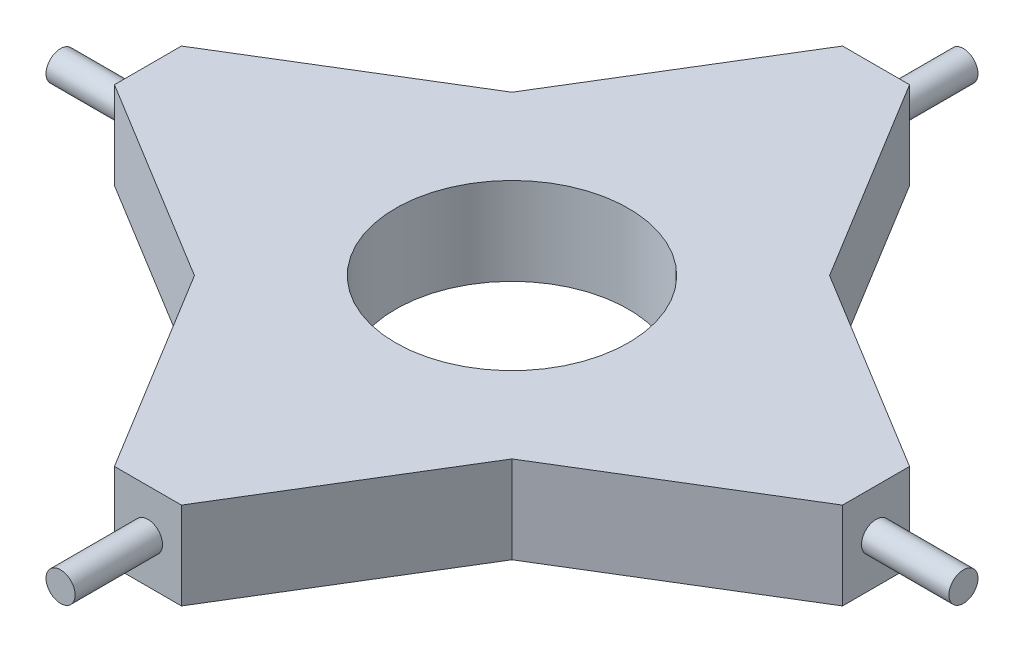
ISO-10303-21;
HEADER;
FILE_DESCRIPTION(('STEP AP214'),'2;1');
FILE_NAME('part.step','',(''),(''),'','','');
FILE_SCHEMA(('AUTOMOTIVE_DESIGN { 1 0 10303 214 1 1 1 1 }'));
ENDSEC;
DATA;
#1=APPLICATION_CONTEXT('core data for automotive mechanical design processes');
#2=APPLICATION_PROTOCOL_DEFINITION('international standard','automotive_design',2000,#1);
#3=PRODUCT_CONTEXT('',#1,'mechanical');
#4=PRODUCT('Part','Part','',(#3));
#5=PRODUCT_RELATED_PRODUCT_CATEGORY('part','',(#4));
#6=PRODUCT_DEFINITION_FORMATION('','',#4);
#7=PRODUCT_DEFINITION_CONTEXT('part definition',#1,'design');
#8=PRODUCT_DEFINITION('design','',#6,#7);
#9=PRODUCT_DEFINITION_SHAPE('','',#8);
#10=(LENGTH_UNIT() NAMED_UNIT(*) SI_UNIT(.MILLI.,.METRE.));
#11=(NAMED_UNIT(*) PLANE_ANGLE_UNIT() SI_UNIT($,.RADIAN.));
#12=(NAMED_UNIT(*) SI_UNIT($,.STERADIAN.) SOLID_ANGLE_UNIT());
#13=UNCERTAINTY_MEASURE_WITH_UNIT(LENGTH_MEASURE(1.E-05),#10,'distance_accuracy_value','');
#14=(GEOMETRIC_REPRESENTATION_CONTEXT(3) GLOBAL_UNCERTAINTY_ASSIGNED_CONTEXT((#13)) GLOBAL_UNIT_ASSIGNED_CONTEXT((#10,
#11,#12)) REPRESENTATION_CONTEXT('',''));
#15=CARTESIAN_POINT('',(0.,0.,0.));
#16=DIRECTION('',(0.,0.,1.));
#17=DIRECTION('',(1.,0.,0.));
#18=AXIS2_PLACEMENT_3D('',#15,#16,#17);
#19=CARTESIAN_POINT('',(0.,30.,0.));
#20=DIRECTION('',(0.,1.,0.));
#21=DIRECTION('',(0.,0.,1.));
#22=AXIS2_PLACEMENT_3D('',#19,#20,#21);
#23=PLANE('',#22);
#24=DIRECTION('',(0.85357003057373,0.,0.520978121331752));
#25=VECTOR('',#24,1.);
#26=CARTESIAN_POINT('',(-125.000000000001,30.,11.5000000000001));
#27=LINE('',#26,#25);
#28=CARTESIAN_POINT('',(-125.000000000001,30.,11.5000000000001));
#29=VERTEX_POINT('',#28);
#30=CARTESIAN_POINT('',(-54.5185124392927,30.,54.5185124392946));
#31=VERTEX_POINT('',#30);
#32=EDGE_CURVE('E185',#29,#31,#27,.T.);
#33=ORIENTED_EDGE('',*,*,#32,.T.);
#34=DIRECTION('',(0.520978121331738,0.,0.853570030573739));
#35=VECTOR('',#34,1.);
#36=CARTESIAN_POINT('',(-11.5000000000009,30.,125.000000000001));
#37=LINE('',#36,#35);
#38=CARTESIAN_POINT('',(-11.5000000000009,30.,125.000000000001));
#39=VERTEX_POINT('',#38);
#40=EDGE_CURVE('E113',#31,#39,#37,.T.);
#41=ORIENTED_EDGE('',*,*,#40,.T.);
#42=DIRECTION('',(1.,0.,0.));
#43=VECTOR('',#42,1.);
#44=CARTESIAN_POINT('',(-11.5000000000009,30.,125.000000000001));
#45=LINE('',#44,#43);
#46=CARTESIAN_POINT('',(11.4999999999991,30.,125.000000000001));
#47=VERTEX_POINT('',#46);
#48=EDGE_CURVE('E230',#39,#47,#45,.T.);
#49=ORIENTED_EDGE('',*,*,#48,.T.);
#50=DIRECTION('',(0.520978121331749,0.,-0.853570030573732));
#51=VECTOR('',#50,1.);
#52=CARTESIAN_POINT('',(11.4999999999991,30.,125.000000000001));
#53=LINE('',#52,#51);
#54=CARTESIAN_POINT('',(54.5185124392932,30.,54.5185124392928));
#55=VERTEX_POINT('',#54);
#56=EDGE_CURVE('E232',#47,#55,#53,.T.);
#57=ORIENTED_EDGE('',*,*,#56,.T.);
#58=DIRECTION('',(0.85357003057374,0.,-0.520978121331736));
#59=VECTOR('',#58,1.);
#60=CARTESIAN_POINT('',(125.,30.,11.500000000001));
#61=LINE('',#60,#59);
#62=CARTESIAN_POINT('',(125.,30.,11.500000000001));
#63=VERTEX_POINT('',#62);
#64=EDGE_CURVE('E234',#55,#63,#61,.T.);
#65=ORIENTED_EDGE('',*,*,#64,.T.);
#66=DIRECTION('',(0.,0.,-1.));
#67=VECTOR('',#66,1.);
#68=CARTESIAN_POINT('',(125.,30.,11.500000000001));
#69=LINE('',#68,#67);
#70=CARTESIAN_POINT('',(125.,30.,-11.499999999999));
#71=VERTEX_POINT('',#70);
#72=EDGE_CURVE('E236',#63,#71,#69,.T.);
#73=ORIENTED_EDGE('',*,*,#72,.T.);
#74=DIRECTION('',(-0.85357003057373,0.,-0.520978121331753));
#75=VECTOR('',#74,1.);
#76=CARTESIAN_POINT('',(125.,30.,-11.499999999999));
#77=LINE('',#76,#75);
#78=CARTESIAN_POINT('',(54.5185124392918,30.,-54.5185124392937));
#79=VERTEX_POINT('',#78);
#80=EDGE_CURVE('E238',#71,#79,#77,.T.);
#81=ORIENTED_EDGE('',*,*,#80,.T.);
#82=DIRECTION('',(-0.520978121331738,0.,-0.853570030573739));
#83=VECTOR('',#82,1.);
#84=CARTESIAN_POINT('',(11.5,30.,-125.));
#85=LINE('',#84,#83);
#86=CARTESIAN_POINT('',(11.5,30.,-125.));
#87=VERTEX_POINT('',#86);
#88=EDGE_CURVE('E240',#79,#87,#85,.T.);
#89=ORIENTED_EDGE('',*,*,#88,.T.);
#90=DIRECTION('',(-1.,0.,0.));
#91=VECTOR('',#90,1.);
#92=CARTESIAN_POINT('',(11.5,30.,-125.));
#93=LINE('',#92,#91);
#94=CARTESIAN_POINT('',(-11.5,30.,-125.));
#95=VERTEX_POINT('',#94);
#96=EDGE_CURVE('E144',#87,#95,#93,.T.);
#97=ORIENTED_EDGE('',*,*,#96,.T.);
#98=DIRECTION('',(-0.520978121331752,0.,0.85357003057373));
#99=VECTOR('',#98,1.);
#100=CARTESIAN_POINT('',(-11.5,30.,-125.));
#101=LINE('',#100,#99);
#102=CARTESIAN_POINT('',(-54.5185124392946,30.,-54.5185124392918));
#103=VERTEX_POINT('',#102);
#104=EDGE_CURVE('E138',#95,#103,#101,.T.);
#105=ORIENTED_EDGE('',*,*,#104,.T.);
#106=DIRECTION('',(-0.853570030573738,0.,0.520978121331738));
#107=VECTOR('',#106,1.);
#108=CARTESIAN_POINT('',(-125.000000000001,30.,-11.4999999999999));
#109=LINE('',#108,#107);
#110=CARTESIAN_POINT('',(-125.000000000001,30.,-11.4999999999999));
#111=VERTEX_POINT('',#110);
#112=EDGE_CURVE('E142',#103,#111,#109,.T.);
#113=ORIENTED_EDGE('',*,*,#112,.T.);
#114=DIRECTION('',(0.,0.,1.));
#115=VECTOR('',#114,1.);
#116=CARTESIAN_POINT('',(-125.000000000001,30.,-11.4999999999999));
#117=LINE('',#116,#115);
#118=EDGE_CURVE('E57',#111,#29,#117,.T.);
#119=ORIENTED_EDGE('',*,*,#118,.T.);
#120=EDGE_LOOP('',(#33,#41,#49,#57,#65,#73,#81,#89,#97,#105,#113,#119));
#121=FACE_BOUND('',#120,.T.);
#122=CARTESIAN_POINT('',(0.,30.,0.));
#123=DIRECTION('',(0.,1.,0.));
#124=DIRECTION('',(0.,0.,1.));
#125=AXIS2_PLACEMENT_3D('',#122,#123,#124);
#126=CIRCLE('',#125,40.);
#127=CARTESIAN_POINT('',(0.,30.,40.));
#128=VERTEX_POINT('',#127);
#129=EDGE_CURVE('E166',#128,#128,#126,.T.);
#130=ORIENTED_EDGE('',*,*,#129,.F.);
#131=EDGE_LOOP('',(#130));
#132=FACE_BOUND('',#131,.T.);
#133=ADVANCED_FACE('F38',(#121,#132),#23,.T.);
#134=CARTESIAN_POINT('',(0.,0.,0.));
#135=DIRECTION('',(0.,1.,0.));
#136=DIRECTION('',(0.,0.,1.));
#137=AXIS2_PLACEMENT_3D('',#134,#135,#136);
#138=PLANE('',#137);
#139=DIRECTION('',(0.85357003057373,0.,0.520978121331752));
#140=VECTOR('',#139,1.);
#141=CARTESIAN_POINT('',(-125.000000000001,0.,11.5000000000001));
#142=LINE('',#141,#140);
#143=CARTESIAN_POINT('',(-125.000000000001,0.,11.5000000000001));
#144=VERTEX_POINT('',#143);
#145=CARTESIAN_POINT('',(-54.5185124392927,0.,54.5185124392946));
#146=VERTEX_POINT('',#145);
#147=EDGE_CURVE('E162',#144,#146,#142,.T.);
#148=ORIENTED_EDGE('',*,*,#147,.F.);
#149=DIRECTION('',(0.,0.,1.));
#150=VECTOR('',#149,1.);
#151=CARTESIAN_POINT('',(-125.000000000001,0.,-11.4999999999999));
#152=LINE('',#151,#150);
#153=CARTESIAN_POINT('',(-125.000000000001,0.,-11.4999999999999));
#154=VERTEX_POINT('',#153);
#155=EDGE_CURVE('E104',#154,#144,#152,.T.);
#156=ORIENTED_EDGE('',*,*,#155,.F.);
#157=DIRECTION('',(-0.853570030573738,0.,0.520978121331738));
#158=VECTOR('',#157,1.);
#159=CARTESIAN_POINT('',(-125.000000000001,0.,-11.4999999999999));
#160=LINE('',#159,#158);
#161=CARTESIAN_POINT('',(-54.5185124392946,0.,-54.5185124392918));
#162=VERTEX_POINT('',#161);
#163=EDGE_CURVE('E98',#162,#154,#160,.T.);
#164=ORIENTED_EDGE('',*,*,#163,.F.);
#165=DIRECTION('',(-0.520978121331752,0.,0.85357003057373));
#166=VECTOR('',#165,1.);
#167=CARTESIAN_POINT('',(-11.5,0.,-125.));
#168=LINE('',#167,#166);
#169=CARTESIAN_POINT('',(-11.5,0.,-125.));
#170=VERTEX_POINT('',#169);
#171=EDGE_CURVE('E152',#170,#162,#168,.T.);
#172=ORIENTED_EDGE('',*,*,#171,.F.);
#173=DIRECTION('',(-1.,0.,0.));
#174=VECTOR('',#173,1.);
#175=CARTESIAN_POINT('',(11.5,0.,-125.));
#176=LINE('',#175,#174);
#177=CARTESIAN_POINT('',(11.5,0.,-125.));
#178=VERTEX_POINT('',#177);
#179=EDGE_CURVE('E180',#178,#170,#176,.T.);
#180=ORIENTED_EDGE('',*,*,#179,.F.);
#181=DIRECTION('',(-0.520978121331738,0.,-0.853570030573739));
#182=VECTOR('',#181,1.);
#183=CARTESIAN_POINT('',(11.5,0.,-125.));
#184=LINE('',#183,#182);
#185=CARTESIAN_POINT('',(54.5185124392918,0.,-54.5185124392937));
#186=VERTEX_POINT('',#185);
#187=EDGE_CURVE('E178',#186,#178,#184,.T.);
#188=ORIENTED_EDGE('',*,*,#187,.F.);
#189=DIRECTION('',(-0.85357003057373,0.,-0.520978121331753));
#190=VECTOR('',#189,1.);
#191=CARTESIAN_POINT('',(125.,0.,-11.499999999999));
#192=LINE('',#191,#190);
#193=CARTESIAN_POINT('',(125.,0.,-11.499999999999));
#194=VERTEX_POINT('',#193);
#195=EDGE_CURVE('E176',#194,#186,#192,.T.);
#196=ORIENTED_EDGE('',*,*,#195,.F.);
#197=DIRECTION('',(0.,0.,-1.));
#198=VECTOR('',#197,1.);
#199=CARTESIAN_POINT('',(125.,0.,11.500000000001));
#200=LINE('',#199,#198);
#201=CARTESIAN_POINT('',(125.,0.,11.500000000001));
#202=VERTEX_POINT('',#201);
#203=EDGE_CURVE('E174',#202,#194,#200,.T.);
#204=ORIENTED_EDGE('',*,*,#203,.F.);
#205=DIRECTION('',(0.85357003057374,0.,-0.520978121331736));
#206=VECTOR('',#205,1.);
#207=CARTESIAN_POINT('',(125.,0.,11.500000000001));
#208=LINE('',#207,#206);
#209=CARTESIAN_POINT('',(54.5185124392932,0.,54.5185124392928));
#210=VERTEX_POINT('',#209);
#211=EDGE_CURVE('E172',#210,#202,#208,.T.);
#212=ORIENTED_EDGE('',*,*,#211,.F.);
#213=DIRECTION('',(0.520978121331749,0.,-0.853570030573732));
#214=VECTOR('',#213,1.);
#215=CARTESIAN_POINT('',(11.4999999999991,0.,125.000000000001));
#216=LINE('',#215,#214);
#217=CARTESIAN_POINT('',(11.4999999999991,0.,125.000000000001));
#218=VERTEX_POINT('',#217);
#219=EDGE_CURVE('E170',#218,#210,#216,.T.);
#220=ORIENTED_EDGE('',*,*,#219,.F.);
#221=DIRECTION('',(1.,0.,0.));
#222=VECTOR('',#221,1.);
#223=CARTESIAN_POINT('',(-11.5000000000009,0.,125.000000000001));
#224=LINE('',#223,#222);
#225=CARTESIAN_POINT('',(-11.5000000000009,0.,125.000000000001));
#226=VERTEX_POINT('',#225);
#227=EDGE_CURVE('E168',#226,#218,#224,.T.);
#228=ORIENTED_EDGE('',*,*,#227,.F.);
#229=DIRECTION('',(0.520978121331738,0.,0.853570030573739));
#230=VECTOR('',#229,1.);
#231=CARTESIAN_POINT('',(-11.5000000000009,0.,125.000000000001));
#232=LINE('',#231,#230);
#233=EDGE_CURVE('E165',#146,#226,#232,.T.);
#234=ORIENTED_EDGE('',*,*,#233,.F.);
#235=EDGE_LOOP('',(#148,#156,#164,#172,#180,#188,#196,#204,#212,#220,#228,#234));
#236=FACE_BOUND('',#235,.T.);
#237=CARTESIAN_POINT('',(0.,0.,0.));
#238=DIRECTION('',(0.,1.,0.));
#239=DIRECTION('',(0.,0.,1.));
#240=AXIS2_PLACEMENT_3D('',#237,#238,#239);
#241=CIRCLE('',#240,40.);
#242=CARTESIAN_POINT('',(0.,0.,40.));
#243=VERTEX_POINT('',#242);
#244=EDGE_CURVE('E225',#243,#243,#241,.T.);
#245=ORIENTED_EDGE('',*,*,#244,.T.);
#246=EDGE_LOOP('',(#245));
#247=FACE_BOUND('',#246,.T.);
#248=ADVANCED_FACE('F253',(#236,#247),#138,.F.);
#249=CARTESIAN_POINT('',(-125.000000000001,30.,11.5000000000001));
#250=DIRECTION('',(0.520978121331752,0.,-0.85357003057373));
#251=DIRECTION('',(-0.85357003057373,0.,-0.520978121331752));
#252=AXIS2_PLACEMENT_3D('',#249,#250,#251);
#253=PLANE('',#252);
#254=ORIENTED_EDGE('',*,*,#147,.T.);
#255=DIRECTION('',(0.,-1.,0.));
#256=VECTOR('',#255,1.);
#257=CARTESIAN_POINT('',(-54.5185124392927,30.,54.5185124392946));
#258=LINE('',#257,#256);
#259=EDGE_CURVE('E42',#31,#146,#258,.T.);
#260=ORIENTED_EDGE('',*,*,#259,.F.);
#261=ORIENTED_EDGE('',*,*,#32,.F.);
#262=DIRECTION('',(0.,-1.,0.));
#263=VECTOR('',#262,1.);
#264=CARTESIAN_POINT('',(-125.000000000001,30.,11.5000000000001));
#265=LINE('',#264,#263);
#266=EDGE_CURVE('E158',#29,#144,#265,.T.);
#267=ORIENTED_EDGE('',*,*,#266,.T.);
#268=EDGE_LOOP('',(#254,#260,#261,#267));
#269=FACE_BOUND('',#268,.T.);
#270=ADVANCED_FACE('F40',(#269),#253,.F.);
#271=CARTESIAN_POINT('',(-11.5000000000009,30.,125.000000000001));
#272=DIRECTION('',(0.853570030573738,0.,-0.520978121331738));
#273=DIRECTION('',(-0.520978121331738,0.,-0.853570030573739));
#274=AXIS2_PLACEMENT_3D('',#271,#272,#273);
#275=PLANE('',#274);
#276=ORIENTED_EDGE('',*,*,#233,.T.);
#277=DIRECTION('',(0.,-1.,0.));
#278=VECTOR('',#277,1.);
#279=CARTESIAN_POINT('',(-11.5000000000009,30.,125.000000000001));
#280=LINE('',#279,#278);
#281=EDGE_CURVE('E206',#39,#226,#280,.T.);
#282=ORIENTED_EDGE('',*,*,#281,.F.);
#283=ORIENTED_EDGE('',*,*,#40,.F.);
#284=ORIENTED_EDGE('',*,*,#259,.T.);
#285=EDGE_LOOP('',(#276,#282,#283,#284));
#286=FACE_BOUND('',#285,.T.);
#287=ADVANCED_FACE('F358',(#286),#275,.F.);
#288=CARTESIAN_POINT('',(-11.5000000000009,30.,125.000000000001));
#289=DIRECTION('',(0.,0.,-1.));
#290=DIRECTION('',(-1.,0.,0.));
#291=AXIS2_PLACEMENT_3D('',#288,#289,#290);
#292=PLANE('',#291);
#293=CARTESIAN_POINT('',(0.,15.,125.000000000001));
#294=DIRECTION('',(0.,0.,1.));
#295=DIRECTION('',(1.,0.,0.));
#296=AXIS2_PLACEMENT_3D('',#293,#294,#295);
#297=CIRCLE('',#296,5.);
#298=CARTESIAN_POINT('',(5.,15.,125.000000000001));
#299=VERTEX_POINT('',#298);
#300=EDGE_CURVE('E211',#299,#299,#297,.T.);
#301=ORIENTED_EDGE('',*,*,#300,.F.);
#302=EDGE_LOOP('',(#301));
#303=FACE_BOUND('',#302,.T.);
#304=ORIENTED_EDGE('',*,*,#227,.T.);
#305=DIRECTION('',(0.,-1.,0.));
#306=VECTOR('',#305,1.);
#307=CARTESIAN_POINT('',(11.4999999999991,30.,125.000000000001));
#308=LINE('',#307,#306);
#309=EDGE_CURVE('E204',#47,#218,#308,.T.);
#310=ORIENTED_EDGE('',*,*,#309,.F.);
#311=ORIENTED_EDGE('',*,*,#48,.F.);
#312=ORIENTED_EDGE('',*,*,#281,.T.);
#313=EDGE_LOOP('',(#304,#310,#311,#312));
#314=FACE_BOUND('',#313,.T.);
#315=ADVANCED_FACE('F355',(#303,#314),#292,.F.);
#316=CARTESIAN_POINT('',(11.4999999999991,30.,125.000000000001));
#317=DIRECTION('',(-0.853570030573732,0.,-0.520978121331748));
#318=DIRECTION('',(-0.520978121331748,0.,0.853570030573732));
#319=AXIS2_PLACEMENT_3D('',#316,#317,#318);
#320=PLANE('',#319);
#321=ORIENTED_EDGE('',*,*,#219,.T.);
#322=DIRECTION('',(0.,-1.,0.));
#323=VECTOR('',#322,1.);
#324=CARTESIAN_POINT('',(54.5185124392932,30.,54.5185124392928));
#325=LINE('',#324,#323);
#326=EDGE_CURVE('E201',#55,#210,#325,.T.);
#327=ORIENTED_EDGE('',*,*,#326,.F.);
#328=ORIENTED_EDGE('',*,*,#56,.F.);
#329=ORIENTED_EDGE('',*,*,#309,.T.);
#330=EDGE_LOOP('',(#321,#327,#328,#329));
#331=FACE_BOUND('',#330,.T.);
#332=ADVANCED_FACE('F351',(#331),#320,.F.);
#333=CARTESIAN_POINT('',(125.,30.,11.500000000001));
#334=DIRECTION('',(-0.520978121331736,0.,-0.85357003057374));
#335=DIRECTION('',(-0.85357003057374,0.,0.520978121331736));
#336=AXIS2_PLACEMENT_3D('',#333,#334,#335);
#337=PLANE('',#336);
#338=ORIENTED_EDGE('',*,*,#211,.T.);
#339=DIRECTION('',(0.,-1.,0.));
#340=VECTOR('',#339,1.);
#341=CARTESIAN_POINT('',(125.,30.,11.500000000001));
#342=LINE('',#341,#340);
#343=EDGE_CURVE('E198',#63,#202,#342,.T.);
#344=ORIENTED_EDGE('',*,*,#343,.F.);
#345=ORIENTED_EDGE('',*,*,#64,.F.);
#346=ORIENTED_EDGE('',*,*,#326,.T.);
#347=EDGE_LOOP('',(#338,#344,#345,#346));
#348=FACE_BOUND('',#347,.T.);
#349=ADVANCED_FACE('F332',(#348),#337,.F.);
#350=CARTESIAN_POINT('',(125.,30.,11.500000000001));
#351=DIRECTION('',(-1.,0.,0.));
#352=DIRECTION('',(0.,0.,1.));
#353=AXIS2_PLACEMENT_3D('',#350,#351,#352);
#354=PLANE('',#353);
#355=CARTESIAN_POINT('',(125.000000000001,15.,-4.36435167355395E-13));
#356=DIRECTION('',(1.,0.,0.));
#357=DIRECTION('',(0.,0.,-1.));
#358=AXIS2_PLACEMENT_3D('',#355,#356,#357);
#359=CIRCLE('',#358,5.);
#360=CARTESIAN_POINT('',(125.000000000001,15.,-5.00000000000044));
#361=VERTEX_POINT('',#360);
#362=EDGE_CURVE('E214',#361,#361,#359,.T.);
#363=ORIENTED_EDGE('',*,*,#362,.F.);
#364=EDGE_LOOP('',(#363));
#365=FACE_BOUND('',#364,.T.);
#366=ORIENTED_EDGE('',*,*,#203,.T.);
#367=DIRECTION('',(0.,-1.,0.));
#368=VECTOR('',#367,1.);
#369=CARTESIAN_POINT('',(125.,30.,-11.499999999999));
#370=LINE('',#369,#368);
#371=EDGE_CURVE('E195',#71,#194,#370,.T.);
#372=ORIENTED_EDGE('',*,*,#371,.F.);
#373=ORIENTED_EDGE('',*,*,#72,.F.);
#374=ORIENTED_EDGE('',*,*,#343,.T.);
#375=EDGE_LOOP('',(#366,#372,#373,#374));
#376=FACE_BOUND('',#375,.T.);
#377=ADVANCED_FACE('F328',(#365,#376),#354,.F.);
#378=CARTESIAN_POINT('',(125.,30.,-11.499999999999));
#379=DIRECTION('',(-0.520978121331753,0.,0.85357003057373));
#380=DIRECTION('',(0.85357003057373,0.,0.520978121331753));
#381=AXIS2_PLACEMENT_3D('',#378,#379,#380);
#382=PLANE('',#381);
#383=ORIENTED_EDGE('',*,*,#195,.T.);
#384=DIRECTION('',(0.,-1.,0.));
#385=VECTOR('',#384,1.);
#386=CARTESIAN_POINT('',(54.5185124392918,30.,-54.5185124392937));
#387=LINE('',#386,#385);
#388=EDGE_CURVE('E192',#79,#186,#387,.T.);
#389=ORIENTED_EDGE('',*,*,#388,.F.);
#390=ORIENTED_EDGE('',*,*,#80,.F.);
#391=ORIENTED_EDGE('',*,*,#371,.T.);
#392=EDGE_LOOP('',(#383,#389,#390,#391));
#393=FACE_BOUND('',#392,.T.);
#394=ADVANCED_FACE('F331',(#393),#382,.F.);
#395=CARTESIAN_POINT('',(11.5,30.,-125.));
#396=DIRECTION('',(-0.853570030573738,0.,0.520978121331738));
#397=DIRECTION('',(0.520978121331738,0.,0.853570030573738));
#398=AXIS2_PLACEMENT_3D('',#395,#396,#397);
#399=PLANE('',#398);
#400=ORIENTED_EDGE('',*,*,#187,.T.);
#401=DIRECTION('',(0.,-1.,0.));
#402=VECTOR('',#401,1.);
#403=CARTESIAN_POINT('',(11.5,30.,-125.));
#404=LINE('',#403,#402);
#405=EDGE_CURVE('E189',#87,#178,#404,.T.);
#406=ORIENTED_EDGE('',*,*,#405,.F.);
#407=ORIENTED_EDGE('',*,*,#88,.F.);
#408=ORIENTED_EDGE('',*,*,#388,.T.);
#409=EDGE_LOOP('',(#400,#406,#407,#408));
#410=FACE_BOUND('',#409,.T.);
#411=ADVANCED_FACE('F246',(#410),#399,.F.);
#412=CARTESIAN_POINT('',(11.5,30.,-125.));
#413=DIRECTION('',(0.,0.,1.));
#414=DIRECTION('',(1.,0.,0.));
#415=AXIS2_PLACEMENT_3D('',#412,#413,#414);
#416=PLANE('',#415);
#417=CARTESIAN_POINT('',(0.,15.,-125.000000000001));
#418=DIRECTION('',(0.,0.,-1.));
#419=DIRECTION('',(-1.,0.,0.));
#420=AXIS2_PLACEMENT_3D('',#417,#418,#419);
#421=CIRCLE('',#420,5.);
#422=CARTESIAN_POINT('',(-5.,15.,-125.000000000001));
#423=VERTEX_POINT('',#422);
#424=EDGE_CURVE('E48',#423,#423,#421,.T.);
#425=ORIENTED_EDGE('',*,*,#424,.F.);
#426=EDGE_LOOP('',(#425));
#427=FACE_BOUND('',#426,.T.);
#428=ORIENTED_EDGE('',*,*,#179,.T.);
#429=DIRECTION('',(0.,-1.,0.));
#430=VECTOR('',#429,1.);
#431=CARTESIAN_POINT('',(-11.5,30.,-125.));
#432=LINE('',#431,#430);
#433=EDGE_CURVE('E153',#95,#170,#432,.T.);
#434=ORIENTED_EDGE('',*,*,#433,.F.);
#435=ORIENTED_EDGE('',*,*,#96,.F.);
#436=ORIENTED_EDGE('',*,*,#405,.T.);
#437=EDGE_LOOP('',(#428,#434,#435,#436));
#438=FACE_BOUND('',#437,.T.);
#439=ADVANCED_FACE('F250',(#427,#438),#416,.F.);
#440=CARTESIAN_POINT('',(-11.5,30.,-125.));
#441=DIRECTION('',(0.85357003057373,0.,0.520978121331752));
#442=DIRECTION('',(0.520978121331752,0.,-0.85357003057373));
#443=AXIS2_PLACEMENT_3D('',#440,#441,#442);
#444=PLANE('',#443);
#445=ORIENTED_EDGE('',*,*,#171,.T.);
#446=DIRECTION('',(0.,-1.,0.));
#447=VECTOR('',#446,1.);
#448=CARTESIAN_POINT('',(-54.5185124392946,30.,-54.5185124392918));
#449=LINE('',#448,#447);
#450=EDGE_CURVE('E149',#103,#162,#449,.T.);
#451=ORIENTED_EDGE('',*,*,#450,.F.);
#452=ORIENTED_EDGE('',*,*,#104,.F.);
#453=ORIENTED_EDGE('',*,*,#433,.T.);
#454=EDGE_LOOP('',(#445,#451,#452,#453));
#455=FACE_BOUND('',#454,.T.);
#456=ADVANCED_FACE('F150',(#455),#444,.F.);
#457=CARTESIAN_POINT('',(-125.000000000001,30.,-11.4999999999999));
#458=DIRECTION('',(0.520978121331738,0.,0.853570030573738));
#459=DIRECTION('',(0.853570030573739,0.,-0.520978121331738));
#460=AXIS2_PLACEMENT_3D('',#457,#458,#459);
#461=PLANE('',#460);
#462=ORIENTED_EDGE('',*,*,#163,.T.);
#463=DIRECTION('',(0.,-1.,0.));
#464=VECTOR('',#463,1.);
#465=CARTESIAN_POINT('',(-125.000000000001,30.,-11.4999999999999));
#466=LINE('',#465,#464);
#467=EDGE_CURVE('E154',#111,#154,#466,.T.);
#468=ORIENTED_EDGE('',*,*,#467,.F.);
#469=ORIENTED_EDGE('',*,*,#112,.F.);
#470=ORIENTED_EDGE('',*,*,#450,.T.);
#471=EDGE_LOOP('',(#462,#468,#469,#470));
#472=FACE_BOUND('',#471,.T.);
#473=ADVANCED_FACE('F156',(#472),#461,.F.);
#474=CARTESIAN_POINT('',(-125.000000000001,30.,-11.4999999999999));
#475=DIRECTION('',(1.,0.,0.));
#476=DIRECTION('',(0.,0.,-1.));
#477=AXIS2_PLACEMENT_3D('',#474,#475,#476);
#478=PLANE('',#477);
#479=CARTESIAN_POINT('',(-125.000000000001,15.,1.30930550206619E-12));
#480=DIRECTION('',(-1.,0.,0.));
#481=DIRECTION('',(0.,0.,1.));
#482=AXIS2_PLACEMENT_3D('',#479,#480,#481);
#483=CIRCLE('',#482,5.);
#484=CARTESIAN_POINT('',(-125.000000000001,15.,5.00000000000131));
#485=VERTEX_POINT('',#484);
#486=EDGE_CURVE('E11',#485,#485,#483,.T.);
#487=ORIENTED_EDGE('',*,*,#486,.F.);
#488=EDGE_LOOP('',(#487));
#489=FACE_BOUND('',#488,.T.);
#490=ORIENTED_EDGE('',*,*,#155,.T.);
#491=ORIENTED_EDGE('',*,*,#266,.F.);
#492=ORIENTED_EDGE('',*,*,#118,.F.);
#493=ORIENTED_EDGE('',*,*,#467,.T.);
#494=EDGE_LOOP('',(#490,#491,#492,#493));
#495=FACE_BOUND('',#494,.T.);
#496=ADVANCED_FACE('F257',(#489,#495),#478,.F.);
#497=CARTESIAN_POINT('',(0.,30.,0.));
#498=DIRECTION('',(0.,-1.,0.));
#499=DIRECTION('',(0.,0.,-1.));
#500=AXIS2_PLACEMENT_3D('',#497,#498,#499);
#501=CYLINDRICAL_SURFACE('',#500,40.);
#502=ORIENTED_EDGE('',*,*,#129,.T.);
#503=EDGE_LOOP('',(#502));
#504=FACE_BOUND('',#503,.T.);
#505=ORIENTED_EDGE('',*,*,#244,.F.);
#506=EDGE_LOOP('',(#505));
#507=FACE_BOUND('',#506,.T.);
#508=ADVANCED_FACE('F259',(#504,#507),#501,.F.);
#509=CARTESIAN_POINT('',(0.,15.,155.000000000001));
#510=DIRECTION('',(0.,0.,-1.));
#511=DIRECTION('',(-1.,0.,0.));
#512=AXIS2_PLACEMENT_3D('',#509,#510,#511);
#513=CYLINDRICAL_SURFACE('',#512,5.);
#514=CARTESIAN_POINT('',(0.,15.,155.000000000001));
#515=DIRECTION('',(0.,0.,1.));
#516=DIRECTION('',(1.,0.,0.));
#517=AXIS2_PLACEMENT_3D('',#514,#515,#516);
#518=CIRCLE('',#517,5.);
#519=CARTESIAN_POINT('',(5.,15.,155.000000000001));
#520=VERTEX_POINT('',#519);
#521=EDGE_CURVE('E222',#520,#520,#518,.T.);
#522=ORIENTED_EDGE('',*,*,#521,.F.);
#523=EDGE_LOOP('',(#522));
#524=FACE_BOUND('',#523,.T.);
#525=ORIENTED_EDGE('',*,*,#300,.T.);
#526=EDGE_LOOP('',(#525));
#527=FACE_BOUND('',#526,.T.);
#528=ADVANCED_FACE('F266',(#524,#527),#513,.T.);
#529=CARTESIAN_POINT('',(0.,15.,155.000000000001));
#530=DIRECTION('',(0.,0.,1.));
#531=DIRECTION('',(1.,0.,0.));
#532=AXIS2_PLACEMENT_3D('',#529,#530,#531);
#533=PLANE('',#532);
#534=ORIENTED_EDGE('',*,*,#521,.T.);
#535=EDGE_LOOP('',(#534));
#536=FACE_BOUND('',#535,.T.);
#537=ADVANCED_FACE('F280',(#536),#533,.T.);
#538=CARTESIAN_POINT('',(155.000000000001,15.,-5.41179607520689E-13));
#539=DIRECTION('',(-1.,0.,0.));
#540=DIRECTION('',(0.,0.,1.));
#541=AXIS2_PLACEMENT_3D('',#538,#539,#540);
#542=CYLINDRICAL_SURFACE('',#541,5.);
#543=CARTESIAN_POINT('',(155.000000000001,15.,-5.41179607520689E-13));
#544=DIRECTION('',(1.,0.,0.));
#545=DIRECTION('',(0.,0.,-1.));
#546=AXIS2_PLACEMENT_3D('',#543,#544,#545);
#547=CIRCLE('',#546,5.);
#548=CARTESIAN_POINT('',(155.000000000001,15.,-5.00000000000054));
#549=VERTEX_POINT('',#548);
#550=EDGE_CURVE('E316',#549,#549,#547,.T.);
#551=ORIENTED_EDGE('',*,*,#550,.F.);
#552=EDGE_LOOP('',(#551));
#553=FACE_BOUND('',#552,.T.);
#554=ORIENTED_EDGE('',*,*,#362,.T.);
#555=EDGE_LOOP('',(#554));
#556=FACE_BOUND('',#555,.T.);
#557=ADVANCED_FACE('F284',(#553,#556),#542,.T.);
#558=CARTESIAN_POINT('',(155.000000000001,15.,-5.41179607520689E-13));
#559=DIRECTION('',(1.,0.,0.));
#560=DIRECTION('',(0.,0.,-1.));
#561=AXIS2_PLACEMENT_3D('',#558,#559,#560);
#562=PLANE('',#561);
#563=ORIENTED_EDGE('',*,*,#550,.T.);
#564=EDGE_LOOP('',(#563));
#565=FACE_BOUND('',#564,.T.);
#566=ADVANCED_FACE('F288',(#565),#562,.T.);
#567=CARTESIAN_POINT('',(0.,15.,-155.000000000001));
#568=DIRECTION('',(0.,0.,1.));
#569=DIRECTION('',(1.,0.,0.));
#570=AXIS2_PLACEMENT_3D('',#567,#568,#569);
#571=CYLINDRICAL_SURFACE('',#570,5.);
#572=CARTESIAN_POINT('',(0.,15.,-155.000000000001));
#573=DIRECTION('',(0.,0.,-1.));
#574=DIRECTION('',(-1.,0.,0.));
#575=AXIS2_PLACEMENT_3D('',#572,#573,#574);
#576=CIRCLE('',#575,5.);
#577=CARTESIAN_POINT('',(-5.,15.,-155.000000000001));
#578=VERTEX_POINT('',#577);
#579=EDGE_CURVE('E313',#578,#578,#576,.T.);
#580=ORIENTED_EDGE('',*,*,#579,.F.);
#581=EDGE_LOOP('',(#580));
#582=FACE_BOUND('',#581,.T.);
#583=ORIENTED_EDGE('',*,*,#424,.T.);
#584=EDGE_LOOP('',(#583));
#585=FACE_BOUND('',#584,.T.);
#586=ADVANCED_FACE('F292',(#582,#585),#571,.T.);
#587=CARTESIAN_POINT('',(0.,15.,-155.000000000001));
#588=DIRECTION('',(0.,0.,-1.));
#589=DIRECTION('',(-1.,0.,0.));
#590=AXIS2_PLACEMENT_3D('',#587,#588,#589);
#591=PLANE('',#590);
#592=ORIENTED_EDGE('',*,*,#579,.T.);
#593=EDGE_LOOP('',(#592));
#594=FACE_BOUND('',#593,.T.);
#595=ADVANCED_FACE('F296',(#594),#591,.T.);
#596=CARTESIAN_POINT('',(-155.000000000001,15.,1.62353882256207E-12));
#597=DIRECTION('',(1.,0.,0.));
#598=DIRECTION('',(0.,0.,-1.));
#599=AXIS2_PLACEMENT_3D('',#596,#597,#598);
#600=CYLINDRICAL_SURFACE('',#599,5.);
#601=CARTESIAN_POINT('',(-155.000000000001,15.,1.62353882256207E-12));
#602=DIRECTION('',(-1.,0.,0.));
#603=DIRECTION('',(0.,0.,1.));
#604=AXIS2_PLACEMENT_3D('',#601,#602,#603);
#605=CIRCLE('',#604,5.);
#606=CARTESIAN_POINT('',(-155.000000000001,15.,5.00000000000162));
#607=VERTEX_POINT('',#606);
#608=EDGE_CURVE('E312',#607,#607,#605,.T.);
#609=ORIENTED_EDGE('',*,*,#608,.F.);
#610=EDGE_LOOP('',(#609));
#611=FACE_BOUND('',#610,.T.);
#612=ORIENTED_EDGE('',*,*,#486,.T.);
#613=EDGE_LOOP('',(#612));
#614=FACE_BOUND('',#613,.T.);
#615=ADVANCED_FACE('F300',(#611,#614),#600,.T.);
#616=CARTESIAN_POINT('',(-155.000000000001,15.,1.62353882256207E-12));
#617=DIRECTION('',(-1.,0.,0.));
#618=DIRECTION('',(0.,0.,1.));
#619=AXIS2_PLACEMENT_3D('',#616,#617,#618);
#620=PLANE('',#619);
#621=ORIENTED_EDGE('',*,*,#608,.T.);
#622=EDGE_LOOP('',(#621));
#623=FACE_BOUND('',#622,.T.);
#624=ADVANCED_FACE('F304',(#623),#620,.T.);
#625=CLOSED_SHELL('',(#133,#248,#270,#287,#315,#332,#349,#377,#394,#411,#439,#456,#473,#496,
#508,#528,#537,#557,#566,#586,#595,#615,#624));
#626=MANIFOLD_SOLID_BREP('B2',#625);
#627=ADVANCED_BREP_SHAPE_REPRESENTATION('',(#18,#626),#14);
#628=SHAPE_DEFINITION_REPRESENTATION(#9,#627);
ENDSEC;
END-ISO-10303-21;
